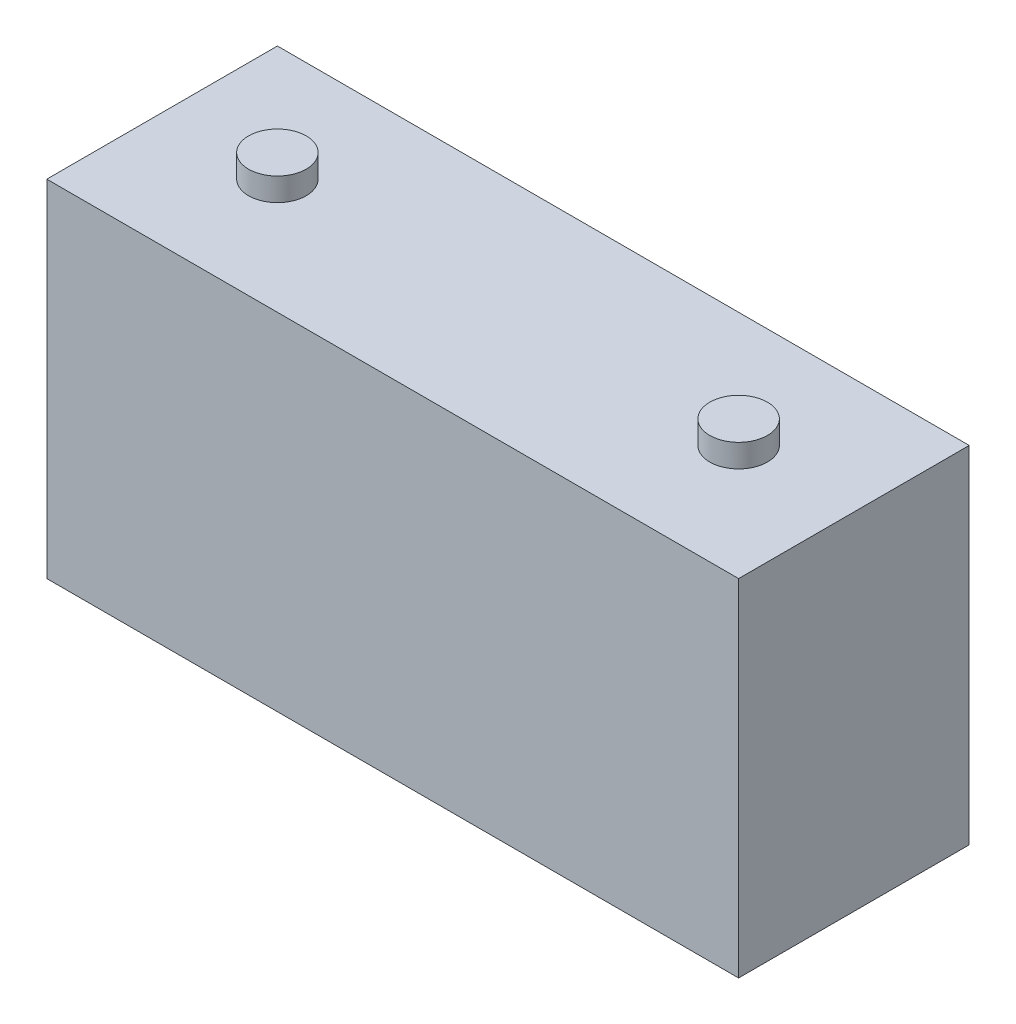
ISO-10303-21;
HEADER;
FILE_DESCRIPTION(('STEP AP214'),'2;1');
FILE_NAME('part.step','',(''),(''),'','','');
FILE_SCHEMA(('AUTOMOTIVE_DESIGN { 1 0 10303 214 1 1 1 1 }'));
ENDSEC;
DATA;
#1=APPLICATION_CONTEXT('core data for automotive mechanical design processes');
#2=APPLICATION_PROTOCOL_DEFINITION('international standard','automotive_design',2000,#1);
#3=PRODUCT_CONTEXT('',#1,'mechanical');
#4=PRODUCT('Part','Part','',(#3));
#5=PRODUCT_RELATED_PRODUCT_CATEGORY('part','',(#4));
#6=PRODUCT_DEFINITION_FORMATION('','',#4);
#7=PRODUCT_DEFINITION_CONTEXT('part definition',#1,'design');
#8=PRODUCT_DEFINITION('design','',#6,#7);
#9=PRODUCT_DEFINITION_SHAPE('','',#8);
#10=(LENGTH_UNIT() NAMED_UNIT(*) SI_UNIT(.MILLI.,.METRE.));
#11=(NAMED_UNIT(*) PLANE_ANGLE_UNIT() SI_UNIT($,.RADIAN.));
#12=(NAMED_UNIT(*) SI_UNIT($,.STERADIAN.) SOLID_ANGLE_UNIT());
#13=UNCERTAINTY_MEASURE_WITH_UNIT(LENGTH_MEASURE(1.E-05),#10,'distance_accuracy_value','');
#14=(GEOMETRIC_REPRESENTATION_CONTEXT(3) GLOBAL_UNCERTAINTY_ASSIGNED_CONTEXT((#13)) GLOBAL_UNIT_ASSIGNED_CONTEXT((#10,
#11,#12)) REPRESENTATION_CONTEXT('',''));
#15=CARTESIAN_POINT('',(0.,0.,0.));
#16=DIRECTION('',(0.,0.,1.));
#17=DIRECTION('',(1.,0.,0.));
#18=AXIS2_PLACEMENT_3D('',#15,#16,#17);
#19=CARTESIAN_POINT('',(300.,-150.,200.));
#20=DIRECTION('',(-1.,0.,0.));
#21=DIRECTION('',(0.,0.,1.));
#22=AXIS2_PLACEMENT_3D('',#19,#20,#21);
#23=PLANE('',#22);
#24=DIRECTION('',(0.,1.,0.));
#25=VECTOR('',#24,1.);
#26=CARTESIAN_POINT('',(300.,-150.,0.));
#27=LINE('',#26,#25);
#28=CARTESIAN_POINT('',(300.,-150.,0.));
#29=VERTEX_POINT('',#28);
#30=CARTESIAN_POINT('',(300.,150.,0.));
#31=VERTEX_POINT('',#30);
#32=EDGE_CURVE('E111',#29,#31,#27,.T.);
#33=ORIENTED_EDGE('',*,*,#32,.T.);
#34=DIRECTION('',(0.,0.,-1.));
#35=VECTOR('',#34,1.);
#36=CARTESIAN_POINT('',(300.,150.,200.));
#37=LINE('',#36,#35);
#38=CARTESIAN_POINT('',(300.,150.,200.));
#39=VERTEX_POINT('',#38);
#40=EDGE_CURVE('E100',#39,#31,#37,.T.);
#41=ORIENTED_EDGE('',*,*,#40,.F.);
#42=DIRECTION('',(0.,1.,0.));
#43=VECTOR('',#42,1.);
#44=CARTESIAN_POINT('',(300.,-150.,200.));
#45=LINE('',#44,#43);
#46=CARTESIAN_POINT('',(300.,-150.,200.));
#47=VERTEX_POINT('',#46);
#48=EDGE_CURVE('E92',#47,#39,#45,.T.);
#49=ORIENTED_EDGE('',*,*,#48,.F.);
#50=DIRECTION('',(0.,0.,-1.));
#51=VECTOR('',#50,1.);
#52=CARTESIAN_POINT('',(300.,-150.,200.));
#53=LINE('',#52,#51);
#54=EDGE_CURVE('E107',#47,#29,#53,.T.);
#55=ORIENTED_EDGE('',*,*,#54,.T.);
#56=EDGE_LOOP('',(#33,#41,#49,#55));
#57=FACE_BOUND('',#56,.T.);
#58=ADVANCED_FACE('F39',(#57),#23,.F.);
#59=CARTESIAN_POINT('',(-300.,150.,200.));
#60=DIRECTION('',(0.,-1.,0.));
#61=DIRECTION('',(0.,0.,-1.));
#62=AXIS2_PLACEMENT_3D('',#59,#60,#61);
#63=PLANE('',#62);
#64=CARTESIAN_POINT('',(-200.,150.,100.));
#65=DIRECTION('',(0.,-1.,0.));
#66=DIRECTION('',(0.,0.,-1.));
#67=AXIS2_PLACEMENT_3D('',#64,#65,#66);
#68=CIRCLE('',#67,25.);
#69=CARTESIAN_POINT('',(-200.,150.,75.0000000000001));
#70=VERTEX_POINT('',#69);
#71=EDGE_CURVE('E11',#70,#70,#68,.F.);
#72=ORIENTED_EDGE('',*,*,#71,.F.);
#73=EDGE_LOOP('',(#72));
#74=FACE_BOUND('',#73,.T.);
#75=CARTESIAN_POINT('',(200.,150.,100.));
#76=DIRECTION('',(0.,-1.,0.));
#77=DIRECTION('',(0.,0.,-1.));
#78=AXIS2_PLACEMENT_3D('',#75,#76,#77);
#79=CIRCLE('',#78,25.);
#80=CARTESIAN_POINT('',(200.,150.,75.));
#81=VERTEX_POINT('',#80);
#82=EDGE_CURVE('E48',#81,#81,#79,.F.);
#83=ORIENTED_EDGE('',*,*,#82,.F.);
#84=EDGE_LOOP('',(#83));
#85=FACE_BOUND('',#84,.T.);
#86=DIRECTION('',(-1.,0.,0.));
#87=VECTOR('',#86,1.);
#88=CARTESIAN_POINT('',(-300.,150.,0.));
#89=LINE('',#88,#87);
#90=CARTESIAN_POINT('',(-300.,150.,0.));
#91=VERTEX_POINT('',#90);
#92=EDGE_CURVE('E98',#31,#91,#89,.T.);
#93=ORIENTED_EDGE('',*,*,#92,.T.);
#94=DIRECTION('',(0.,0.,-1.));
#95=VECTOR('',#94,1.);
#96=CARTESIAN_POINT('',(-300.,150.,200.));
#97=LINE('',#96,#95);
#98=CARTESIAN_POINT('',(-300.,150.,200.));
#99=VERTEX_POINT('',#98);
#100=EDGE_CURVE('E96',#99,#91,#97,.T.);
#101=ORIENTED_EDGE('',*,*,#100,.F.);
#102=DIRECTION('',(-1.,0.,0.));
#103=VECTOR('',#102,1.);
#104=CARTESIAN_POINT('',(-300.,150.,200.));
#105=LINE('',#104,#103);
#106=EDGE_CURVE('E87',#39,#99,#105,.T.);
#107=ORIENTED_EDGE('',*,*,#106,.F.);
#108=ORIENTED_EDGE('',*,*,#40,.T.);
#109=EDGE_LOOP('',(#93,#101,#107,#108));
#110=FACE_BOUND('',#109,.T.);
#111=ADVANCED_FACE('F97',(#74,#85,#110),#63,.F.);
#112=CARTESIAN_POINT('',(-300.,-150.,200.));
#113=DIRECTION('',(1.,0.,0.));
#114=DIRECTION('',(0.,0.,-1.));
#115=AXIS2_PLACEMENT_3D('',#112,#113,#114);
#116=PLANE('',#115);
#117=DIRECTION('',(0.,-1.,0.));
#118=VECTOR('',#117,1.);
#119=CARTESIAN_POINT('',(-300.,-150.,0.));
#120=LINE('',#119,#118);
#121=CARTESIAN_POINT('',(-300.,-150.,0.));
#122=VERTEX_POINT('',#121);
#123=EDGE_CURVE('E73',#91,#122,#120,.T.);
#124=ORIENTED_EDGE('',*,*,#123,.T.);
#125=DIRECTION('',(0.,0.,-1.));
#126=VECTOR('',#125,1.);
#127=CARTESIAN_POINT('',(-300.,-150.,200.));
#128=LINE('',#127,#126);
#129=CARTESIAN_POINT('',(-300.,-150.,200.));
#130=VERTEX_POINT('',#129);
#131=EDGE_CURVE('E101',#130,#122,#128,.T.);
#132=ORIENTED_EDGE('',*,*,#131,.F.);
#133=DIRECTION('',(0.,-1.,0.));
#134=VECTOR('',#133,1.);
#135=CARTESIAN_POINT('',(-300.,-150.,200.));
#136=LINE('',#135,#134);
#137=EDGE_CURVE('E90',#99,#130,#136,.T.);
#138=ORIENTED_EDGE('',*,*,#137,.F.);
#139=ORIENTED_EDGE('',*,*,#100,.T.);
#140=EDGE_LOOP('',(#124,#132,#138,#139));
#141=FACE_BOUND('',#140,.T.);
#142=ADVANCED_FACE('F103',(#141),#116,.F.);
#143=CARTESIAN_POINT('',(-300.,-150.,200.));
#144=DIRECTION('',(0.,1.,0.));
#145=DIRECTION('',(0.,0.,1.));
#146=AXIS2_PLACEMENT_3D('',#143,#144,#145);
#147=PLANE('',#146);
#148=CARTESIAN_POINT('',(200.,-150.,100.));
#149=DIRECTION('',(0.,1.,0.));
#150=DIRECTION('',(0.,0.,1.));
#151=AXIS2_PLACEMENT_3D('',#148,#149,#150);
#152=CIRCLE('',#151,25.);
#153=CARTESIAN_POINT('',(200.,-150.,125.));
#154=VERTEX_POINT('',#153);
#155=EDGE_CURVE('E132',#154,#154,#152,.F.);
#156=ORIENTED_EDGE('',*,*,#155,.F.);
#157=EDGE_LOOP('',(#156));
#158=FACE_BOUND('',#157,.T.);
#159=CARTESIAN_POINT('',(-200.,-150.,100.));
#160=DIRECTION('',(0.,1.,0.));
#161=DIRECTION('',(0.,0.,1.));
#162=AXIS2_PLACEMENT_3D('',#159,#160,#161);
#163=CIRCLE('',#162,25.);
#164=CARTESIAN_POINT('',(-200.,-150.,125.));
#165=VERTEX_POINT('',#164);
#166=EDGE_CURVE('E128',#165,#165,#163,.F.);
#167=ORIENTED_EDGE('',*,*,#166,.F.);
#168=EDGE_LOOP('',(#167));
#169=FACE_BOUND('',#168,.T.);
#170=DIRECTION('',(1.,0.,0.));
#171=VECTOR('',#170,1.);
#172=CARTESIAN_POINT('',(-300.,-150.,0.));
#173=LINE('',#172,#171);
#174=EDGE_CURVE('E79',#122,#29,#173,.T.);
#175=ORIENTED_EDGE('',*,*,#174,.T.);
#176=ORIENTED_EDGE('',*,*,#54,.F.);
#177=DIRECTION('',(1.,0.,0.));
#178=VECTOR('',#177,1.);
#179=CARTESIAN_POINT('',(-300.,-150.,200.));
#180=LINE('',#179,#178);
#181=EDGE_CURVE('E56',#130,#47,#180,.T.);
#182=ORIENTED_EDGE('',*,*,#181,.F.);
#183=ORIENTED_EDGE('',*,*,#131,.T.);
#184=EDGE_LOOP('',(#175,#176,#182,#183));
#185=FACE_BOUND('',#184,.T.);
#186=ADVANCED_FACE('F148',(#158,#169,#185),#147,.F.);
#187=CARTESIAN_POINT('',(0.,0.,200.));
#188=DIRECTION('',(0.,0.,-1.));
#189=DIRECTION('',(-1.,0.,0.));
#190=AXIS2_PLACEMENT_3D('',#187,#188,#189);
#191=PLANE('',#190);
#192=ORIENTED_EDGE('',*,*,#48,.T.);
#193=ORIENTED_EDGE('',*,*,#106,.T.);
#194=ORIENTED_EDGE('',*,*,#137,.T.);
#195=ORIENTED_EDGE('',*,*,#181,.T.);
#196=EDGE_LOOP('',(#192,#193,#194,#195));
#197=FACE_BOUND('',#196,.T.);
#198=ADVANCED_FACE('F88',(#197),#191,.F.);
#199=CARTESIAN_POINT('',(0.,0.,0.));
#200=DIRECTION('',(0.,0.,-1.));
#201=DIRECTION('',(-1.,0.,0.));
#202=AXIS2_PLACEMENT_3D('',#199,#200,#201);
#203=PLANE('',#202);
#204=ORIENTED_EDGE('',*,*,#32,.F.);
#205=ORIENTED_EDGE('',*,*,#174,.F.);
#206=ORIENTED_EDGE('',*,*,#123,.F.);
#207=ORIENTED_EDGE('',*,*,#92,.F.);
#208=EDGE_LOOP('',(#204,#205,#206,#207));
#209=FACE_BOUND('',#208,.T.);
#210=ADVANCED_FACE('F157',(#209),#203,.T.);
#211=CARTESIAN_POINT('',(-200.,-170.,100.));
#212=DIRECTION('',(0.,1.,0.));
#213=DIRECTION('',(0.,0.,1.));
#214=AXIS2_PLACEMENT_3D('',#211,#212,#213);
#215=CYLINDRICAL_SURFACE('',#214,25.);
#216=CARTESIAN_POINT('',(-200.,-170.,100.));
#217=DIRECTION('',(0.,-1.,0.));
#218=DIRECTION('',(0.,0.,-1.));
#219=AXIS2_PLACEMENT_3D('',#216,#217,#218);
#220=CIRCLE('',#219,25.);
#221=CARTESIAN_POINT('',(-200.,-170.,75.));
#222=VERTEX_POINT('',#221);
#223=EDGE_CURVE('E115',#222,#222,#220,.T.);
#224=ORIENTED_EDGE('',*,*,#223,.F.);
#225=EDGE_LOOP('',(#224));
#226=FACE_BOUND('',#225,.T.);
#227=ORIENTED_EDGE('',*,*,#166,.T.);
#228=EDGE_LOOP('',(#227));
#229=FACE_BOUND('',#228,.T.);
#230=ADVANCED_FACE('F160',(#226,#229),#215,.T.);
#231=CARTESIAN_POINT('',(-200.,-170.,100.));
#232=DIRECTION('',(0.,-1.,0.));
#233=DIRECTION('',(0.,0.,-1.));
#234=AXIS2_PLACEMENT_3D('',#231,#232,#233);
#235=PLANE('',#234);
#236=ORIENTED_EDGE('',*,*,#223,.T.);
#237=EDGE_LOOP('',(#236));
#238=FACE_BOUND('',#237,.T.);
#239=ADVANCED_FACE('F166',(#238),#235,.T.);
#240=CARTESIAN_POINT('',(200.,-170.,100.));
#241=DIRECTION('',(0.,1.,0.));
#242=DIRECTION('',(0.,0.,1.));
#243=AXIS2_PLACEMENT_3D('',#240,#241,#242);
#244=CYLINDRICAL_SURFACE('',#243,25.);
#245=CARTESIAN_POINT('',(200.,-170.,100.));
#246=DIRECTION('',(0.,-1.,0.));
#247=DIRECTION('',(0.,0.,-1.));
#248=AXIS2_PLACEMENT_3D('',#245,#246,#247);
#249=CIRCLE('',#248,25.);
#250=CARTESIAN_POINT('',(200.,-170.,75.));
#251=VERTEX_POINT('',#250);
#252=EDGE_CURVE('E203',#251,#251,#249,.T.);
#253=ORIENTED_EDGE('',*,*,#252,.F.);
#254=EDGE_LOOP('',(#253));
#255=FACE_BOUND('',#254,.T.);
#256=ORIENTED_EDGE('',*,*,#155,.T.);
#257=EDGE_LOOP('',(#256));
#258=FACE_BOUND('',#257,.T.);
#259=ADVANCED_FACE('F170',(#255,#258),#244,.T.);
#260=CARTESIAN_POINT('',(200.,-170.,100.));
#261=DIRECTION('',(0.,-1.,0.));
#262=DIRECTION('',(0.,0.,-1.));
#263=AXIS2_PLACEMENT_3D('',#260,#261,#262);
#264=PLANE('',#263);
#265=ORIENTED_EDGE('',*,*,#252,.T.);
#266=EDGE_LOOP('',(#265));
#267=FACE_BOUND('',#266,.T.);
#268=ADVANCED_FACE('F174',(#267),#264,.T.);
#269=CARTESIAN_POINT('',(200.,170.,100.));
#270=DIRECTION('',(0.,-1.,0.));
#271=DIRECTION('',(0.,0.,-1.));
#272=AXIS2_PLACEMENT_3D('',#269,#270,#271);
#273=CYLINDRICAL_SURFACE('',#272,25.);
#274=CARTESIAN_POINT('',(200.,170.,100.));
#275=DIRECTION('',(0.,1.,0.));
#276=DIRECTION('',(0.,0.,1.));
#277=AXIS2_PLACEMENT_3D('',#274,#275,#276);
#278=CIRCLE('',#277,25.);
#279=CARTESIAN_POINT('',(200.,170.,125.));
#280=VERTEX_POINT('',#279);
#281=EDGE_CURVE('E199',#280,#280,#278,.T.);
#282=ORIENTED_EDGE('',*,*,#281,.F.);
#283=EDGE_LOOP('',(#282));
#284=FACE_BOUND('',#283,.T.);
#285=ORIENTED_EDGE('',*,*,#82,.T.);
#286=EDGE_LOOP('',(#285));
#287=FACE_BOUND('',#286,.T.);
#288=ADVANCED_FACE('F139',(#284,#287),#273,.T.);
#289=CARTESIAN_POINT('',(200.,170.,100.));
#290=DIRECTION('',(0.,1.,0.));
#291=DIRECTION('',(0.,0.,1.));
#292=AXIS2_PLACEMENT_3D('',#289,#290,#291);
#293=PLANE('',#292);
#294=ORIENTED_EDGE('',*,*,#281,.T.);
#295=EDGE_LOOP('',(#294));
#296=FACE_BOUND('',#295,.T.);
#297=ADVANCED_FACE('F181',(#296),#293,.T.);
#298=CARTESIAN_POINT('',(-200.,170.,100.));
#299=DIRECTION('',(0.,-1.,0.));
#300=DIRECTION('',(0.,0.,-1.));
#301=AXIS2_PLACEMENT_3D('',#298,#299,#300);
#302=CYLINDRICAL_SURFACE('',#301,25.);
#303=CARTESIAN_POINT('',(-200.,170.,100.));
#304=DIRECTION('',(0.,1.,0.));
#305=DIRECTION('',(0.,0.,1.));
#306=AXIS2_PLACEMENT_3D('',#303,#304,#305);
#307=CIRCLE('',#306,25.);
#308=CARTESIAN_POINT('',(-200.,170.,125.));
#309=VERTEX_POINT('',#308);
#310=EDGE_CURVE('E197',#309,#309,#307,.T.);
#311=ORIENTED_EDGE('',*,*,#310,.F.);
#312=EDGE_LOOP('',(#311));
#313=FACE_BOUND('',#312,.T.);
#314=ORIENTED_EDGE('',*,*,#71,.T.);
#315=EDGE_LOOP('',(#314));
#316=FACE_BOUND('',#315,.T.);
#317=ADVANCED_FACE('F185',(#313,#316),#302,.T.);
#318=CARTESIAN_POINT('',(-200.,170.,100.));
#319=DIRECTION('',(0.,1.,0.));
#320=DIRECTION('',(0.,0.,1.));
#321=AXIS2_PLACEMENT_3D('',#318,#319,#320);
#322=PLANE('',#321);
#323=ORIENTED_EDGE('',*,*,#310,.T.);
#324=EDGE_LOOP('',(#323));
#325=FACE_BOUND('',#324,.T.);
#326=ADVANCED_FACE('F189',(#325),#322,.T.);
#327=CLOSED_SHELL('',(#58,#111,#142,#186,#198,#210,#230,#239,#259,#268,#288,#297,#317,#326));
#328=MANIFOLD_SOLID_BREP('B2',#327);
#329=ADVANCED_BREP_SHAPE_REPRESENTATION('',(#18,#328),#14);
#330=SHAPE_DEFINITION_REPRESENTATION(#9,#329);
ENDSEC;
END-ISO-10303-21;
